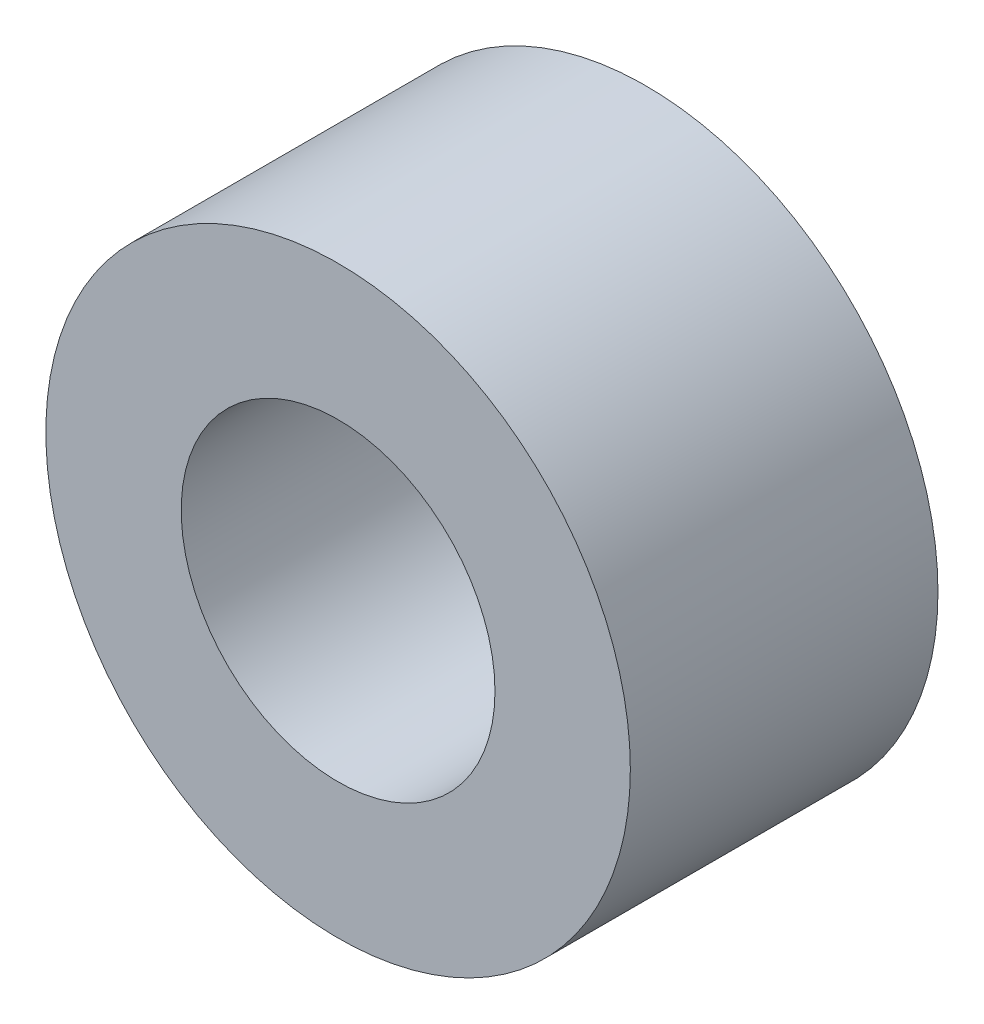
ISO-10303-21;
HEADER;
FILE_DESCRIPTION(('STEP AP214'),'2;1');
FILE_NAME('part.step','',(''),(''),'','','');
FILE_SCHEMA(('AUTOMOTIVE_DESIGN { 1 0 10303 214 1 1 1 1 }'));
ENDSEC;
DATA;
#1=APPLICATION_CONTEXT('core data for automotive mechanical design processes');
#2=APPLICATION_PROTOCOL_DEFINITION('international standard','automotive_design',2000,#1);
#3=PRODUCT_CONTEXT('',#1,'mechanical');
#4=PRODUCT('Part','Part','',(#3));
#5=PRODUCT_RELATED_PRODUCT_CATEGORY('part','',(#4));
#6=PRODUCT_DEFINITION_FORMATION('','',#4);
#7=PRODUCT_DEFINITION_CONTEXT('part definition',#1,'design');
#8=PRODUCT_DEFINITION('design','',#6,#7);
#9=PRODUCT_DEFINITION_SHAPE('','',#8);
#10=(LENGTH_UNIT() NAMED_UNIT(*) SI_UNIT(.MILLI.,.METRE.));
#11=(NAMED_UNIT(*) PLANE_ANGLE_UNIT() SI_UNIT($,.RADIAN.));
#12=(NAMED_UNIT(*) SI_UNIT($,.STERADIAN.) SOLID_ANGLE_UNIT());
#13=UNCERTAINTY_MEASURE_WITH_UNIT(LENGTH_MEASURE(1.E-05),#10,'distance_accuracy_value','');
#14=(GEOMETRIC_REPRESENTATION_CONTEXT(3) GLOBAL_UNCERTAINTY_ASSIGNED_CONTEXT((#13)) GLOBAL_UNIT_ASSIGNED_CONTEXT((#10,
#11,#12)) REPRESENTATION_CONTEXT('',''));
#15=CARTESIAN_POINT('',(0.,0.,0.));
#16=DIRECTION('',(0.,0.,1.));
#17=DIRECTION('',(1.,0.,0.));
#18=AXIS2_PLACEMENT_3D('',#15,#16,#17);
#19=CARTESIAN_POINT('',(0.,0.,5.));
#20=DIRECTION('',(0.,0.,1.));
#21=DIRECTION('',(1.,0.,0.));
#22=AXIS2_PLACEMENT_3D('',#19,#20,#21);
#23=PLANE('',#22);
#24=CARTESIAN_POINT('',(0.,0.,5.));
#25=DIRECTION('',(0.,0.,1.));
#26=DIRECTION('',(1.,0.,0.));
#27=AXIS2_PLACEMENT_3D('',#24,#25,#26);
#28=CIRCLE('',#27,4.75);
#29=CARTESIAN_POINT('',(4.75,0.,5.));
#30=VERTEX_POINT('',#29);
#31=EDGE_CURVE('E10',#30,#30,#28,.T.);
#32=ORIENTED_EDGE('',*,*,#31,.T.);
#33=EDGE_LOOP('',(#32));
#34=FACE_BOUND('',#33,.T.);
#35=CARTESIAN_POINT('',(0.,0.,5.));
#36=DIRECTION('',(0.,0.,1.));
#37=DIRECTION('',(1.,0.,0.));
#38=AXIS2_PLACEMENT_3D('',#35,#36,#37);
#39=CIRCLE('',#38,2.55);
#40=CARTESIAN_POINT('',(2.55,0.,5.));
#41=VERTEX_POINT('',#40);
#42=EDGE_CURVE('E44',#41,#41,#39,.T.);
#43=ORIENTED_EDGE('',*,*,#42,.F.);
#44=EDGE_LOOP('',(#43));
#45=FACE_BOUND('',#44,.T.);
#46=ADVANCED_FACE('F33',(#34,#45),#23,.T.);
#47=CARTESIAN_POINT('',(0.,0.,0.));
#48=DIRECTION('',(0.,0.,1.));
#49=DIRECTION('',(1.,0.,0.));
#50=AXIS2_PLACEMENT_3D('',#47,#48,#49);
#51=PLANE('',#50);
#52=CARTESIAN_POINT('',(0.,0.,0.));
#53=DIRECTION('',(0.,0.,1.));
#54=DIRECTION('',(1.,0.,0.));
#55=AXIS2_PLACEMENT_3D('',#52,#53,#54);
#56=CIRCLE('',#55,4.75);
#57=CARTESIAN_POINT('',(4.75,0.,0.));
#58=VERTEX_POINT('',#57);
#59=EDGE_CURVE('E37',#58,#58,#56,.T.);
#60=ORIENTED_EDGE('',*,*,#59,.F.);
#61=EDGE_LOOP('',(#60));
#62=FACE_BOUND('',#61,.T.);
#63=CARTESIAN_POINT('',(0.,0.,0.));
#64=DIRECTION('',(0.,0.,1.));
#65=DIRECTION('',(1.,0.,0.));
#66=AXIS2_PLACEMENT_3D('',#63,#64,#65);
#67=CIRCLE('',#66,2.55);
#68=CARTESIAN_POINT('',(2.55,0.,0.));
#69=VERTEX_POINT('',#68);
#70=EDGE_CURVE('E46',#69,#69,#67,.T.);
#71=ORIENTED_EDGE('',*,*,#70,.T.);
#72=EDGE_LOOP('',(#71));
#73=FACE_BOUND('',#72,.T.);
#74=ADVANCED_FACE('F56',(#62,#73),#51,.F.);
#75=CARTESIAN_POINT('',(0.,0.,5.));
#76=DIRECTION('',(0.,0.,-1.));
#77=DIRECTION('',(-1.,0.,0.));
#78=AXIS2_PLACEMENT_3D('',#75,#76,#77);
#79=CYLINDRICAL_SURFACE('',#78,4.75);
#80=ORIENTED_EDGE('',*,*,#31,.F.);
#81=EDGE_LOOP('',(#80));
#82=FACE_BOUND('',#81,.T.);
#83=ORIENTED_EDGE('',*,*,#59,.T.);
#84=EDGE_LOOP('',(#83));
#85=FACE_BOUND('',#84,.T.);
#86=ADVANCED_FACE('F35',(#82,#85),#79,.T.);
#87=CARTESIAN_POINT('',(0.,0.,5.));
#88=DIRECTION('',(0.,0.,-1.));
#89=DIRECTION('',(-1.,0.,0.));
#90=AXIS2_PLACEMENT_3D('',#87,#88,#89);
#91=CYLINDRICAL_SURFACE('',#90,2.55);
#92=ORIENTED_EDGE('',*,*,#42,.T.);
#93=EDGE_LOOP('',(#92));
#94=FACE_BOUND('',#93,.T.);
#95=ORIENTED_EDGE('',*,*,#70,.F.);
#96=EDGE_LOOP('',(#95));
#97=FACE_BOUND('',#96,.T.);
#98=ADVANCED_FACE('F52',(#94,#97),#91,.F.);
#99=CLOSED_SHELL('',(#46,#74,#86,#98));
#100=MANIFOLD_SOLID_BREP('B2',#99);
#101=ADVANCED_BREP_SHAPE_REPRESENTATION('',(#18,#100),#14);
#102=SHAPE_DEFINITION_REPRESENTATION(#9,#101);
ENDSEC;
END-ISO-10303-21;
